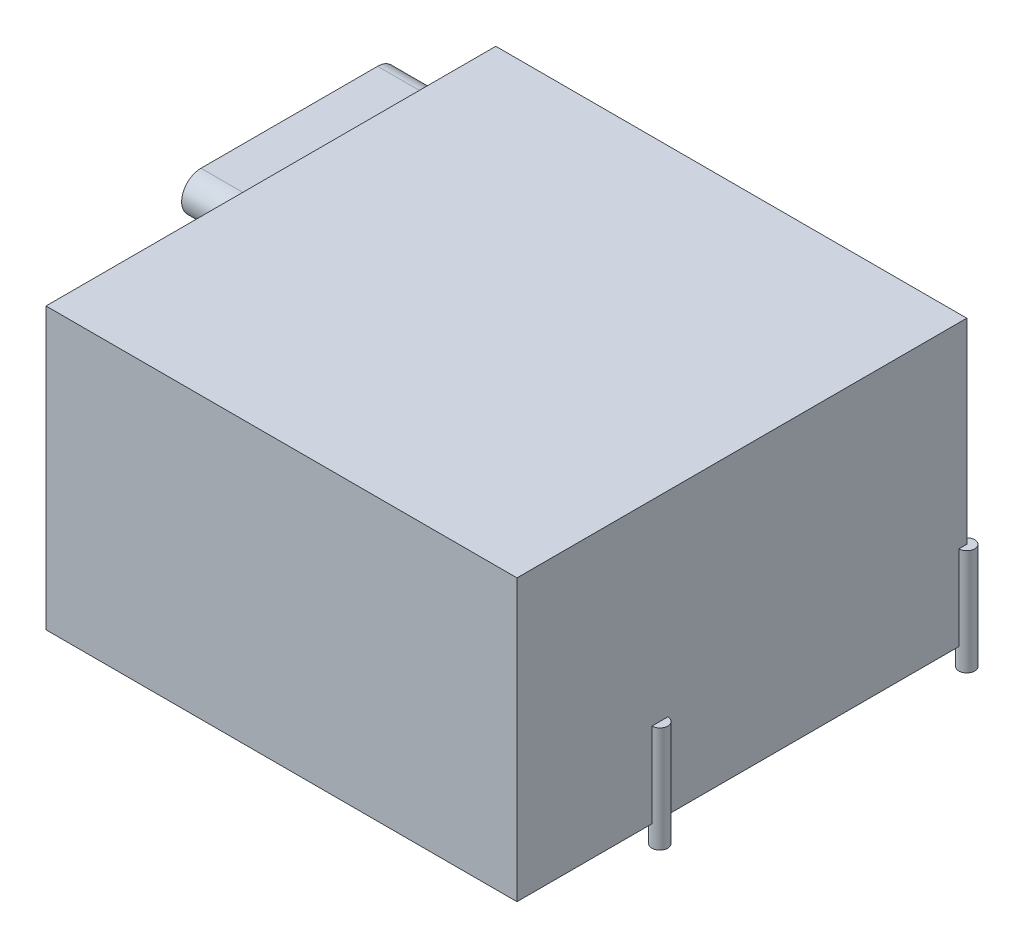
ISO-10303-21;
HEADER;
FILE_DESCRIPTION(('STEP AP214'),'2;1');
FILE_NAME('part.step','',(''),(''),'','','');
FILE_SCHEMA(('AUTOMOTIVE_DESIGN { 1 0 10303 214 1 1 1 1 }'));
ENDSEC;
DATA;
#1=APPLICATION_CONTEXT('core data for automotive mechanical design processes');
#2=APPLICATION_PROTOCOL_DEFINITION('international standard','automotive_design',2000,#1);
#3=PRODUCT_CONTEXT('',#1,'mechanical');
#4=PRODUCT('Part','Part','',(#3));
#5=PRODUCT_RELATED_PRODUCT_CATEGORY('part','',(#4));
#6=PRODUCT_DEFINITION_FORMATION('','',#4);
#7=PRODUCT_DEFINITION_CONTEXT('part definition',#1,'design');
#8=PRODUCT_DEFINITION('design','',#6,#7);
#9=PRODUCT_DEFINITION_SHAPE('','',#8);
#10=(LENGTH_UNIT() NAMED_UNIT(*) SI_UNIT(.MILLI.,.METRE.));
#11=(NAMED_UNIT(*) PLANE_ANGLE_UNIT() SI_UNIT($,.RADIAN.));
#12=(NAMED_UNIT(*) SI_UNIT($,.STERADIAN.) SOLID_ANGLE_UNIT());
#13=UNCERTAINTY_MEASURE_WITH_UNIT(LENGTH_MEASURE(1.E-05),#10,'distance_accuracy_value','');
#14=(GEOMETRIC_REPRESENTATION_CONTEXT(3) GLOBAL_UNCERTAINTY_ASSIGNED_CONTEXT((#13)) GLOBAL_UNIT_ASSIGNED_CONTEXT((#10,
#11,#12)) REPRESENTATION_CONTEXT('',''));
#15=CARTESIAN_POINT('',(0.,0.,0.));
#16=DIRECTION('',(0.,0.,1.));
#17=DIRECTION('',(1.,0.,0.));
#18=AXIS2_PLACEMENT_3D('',#15,#16,#17);
#19=CARTESIAN_POINT('',(-44.5,4.,-29.));
#20=DIRECTION('',(0.,0.,-1.));
#21=DIRECTION('',(-1.,0.,0.));
#22=AXIS2_PLACEMENT_3D('',#19,#20,#21);
#23=PLANE('',#22);
#24=DIRECTION('',(1.,0.,0.));
#25=VECTOR('',#24,1.);
#26=CARTESIAN_POINT('',(-44.5,20.,-29.));
#27=LINE('',#26,#25);
#28=CARTESIAN_POINT('',(43.,20.,-29.));
#29=VERTEX_POINT('',#28);
#30=CARTESIAN_POINT('',(44.5,20.,-29.));
#31=VERTEX_POINT('',#30);
#32=EDGE_CURVE('E11',#29,#31,#27,.T.);
#33=ORIENTED_EDGE('',*,*,#32,.F.);
#34=DIRECTION('',(0.,-1.,0.));
#35=VECTOR('',#34,1.);
#36=CARTESIAN_POINT('',(43.,20.,-29.));
#37=LINE('',#36,#35);
#38=CARTESIAN_POINT('',(43.,4.,-29.));
#39=VERTEX_POINT('',#38);
#40=EDGE_CURVE('E243',#29,#39,#37,.T.);
#41=ORIENTED_EDGE('',*,*,#40,.T.);
#42=DIRECTION('',(-1.,0.,0.));
#43=VECTOR('',#42,1.);
#44=CARTESIAN_POINT('',(-44.5,4.,-29.));
#45=LINE('',#44,#43);
#46=CARTESIAN_POINT('',(-43.,4.,-29.));
#47=VERTEX_POINT('',#46);
#48=EDGE_CURVE('E300',#39,#47,#45,.T.);
#49=ORIENTED_EDGE('',*,*,#48,.T.);
#50=DIRECTION('',(0.,-1.,0.));
#51=VECTOR('',#50,1.);
#52=CARTESIAN_POINT('',(-43.,20.,-29.));
#53=LINE('',#52,#51);
#54=CARTESIAN_POINT('',(-43.,20.,-29.));
#55=VERTEX_POINT('',#54);
#56=EDGE_CURVE('E268',#47,#55,#53,.F.);
#57=ORIENTED_EDGE('',*,*,#56,.T.);
#58=DIRECTION('',(1.,0.,0.));
#59=VECTOR('',#58,1.);
#60=CARTESIAN_POINT('',(-44.5,20.,-29.));
#61=LINE('',#60,#59);
#62=CARTESIAN_POINT('',(-44.5,20.,-29.));
#63=VERTEX_POINT('',#62);
#64=EDGE_CURVE('E330',#63,#55,#61,.T.);
#65=ORIENTED_EDGE('',*,*,#64,.F.);
#66=DIRECTION('',(0.,1.,0.));
#67=VECTOR('',#66,1.);
#68=CARTESIAN_POINT('',(-44.5,4.,-29.));
#69=LINE('',#68,#67);
#70=CARTESIAN_POINT('',(-44.5,57.,-29.));
#71=VERTEX_POINT('',#70);
#72=EDGE_CURVE('E303',#63,#71,#69,.T.);
#73=ORIENTED_EDGE('',*,*,#72,.T.);
#74=DIRECTION('',(-1.,0.,0.));
#75=VECTOR('',#74,1.);
#76=CARTESIAN_POINT('',(-44.5,57.,-29.));
#77=LINE('',#76,#75);
#78=CARTESIAN_POINT('',(44.5,57.,-29.));
#79=VERTEX_POINT('',#78);
#80=EDGE_CURVE('E287',#79,#71,#77,.T.);
#81=ORIENTED_EDGE('',*,*,#80,.F.);
#82=DIRECTION('',(0.,1.,0.));
#83=VECTOR('',#82,1.);
#84=CARTESIAN_POINT('',(44.5,4.,-29.));
#85=LINE('',#84,#83);
#86=EDGE_CURVE('E306',#31,#79,#85,.T.);
#87=ORIENTED_EDGE('',*,*,#86,.F.);
#88=EDGE_LOOP('',(#33,#41,#49,#57,#65,#73,#81,#87));
#89=FACE_BOUND('',#88,.T.);
#90=DIRECTION('',(1.,0.,0.));
#91=VECTOR('',#90,1.);
#92=CARTESIAN_POINT('',(26.8,31.15,-29.));
#93=LINE('',#92,#91);
#94=CARTESIAN_POINT('',(26.8,31.15,-29.));
#95=VERTEX_POINT('',#94);
#96=CARTESIAN_POINT('',(34.8,31.15,-29.));
#97=VERTEX_POINT('',#96);
#98=EDGE_CURVE('E638',#95,#97,#93,.T.);
#99=ORIENTED_EDGE('',*,*,#98,.F.);
#100=DIRECTION('',(0.,1.,0.));
#101=VECTOR('',#100,1.);
#102=CARTESIAN_POINT('',(26.8,23.15,-29.));
#103=LINE('',#102,#101);
#104=CARTESIAN_POINT('',(26.8,23.15,-29.));
#105=VERTEX_POINT('',#104);
#106=EDGE_CURVE('E206',#105,#95,#103,.T.);
#107=ORIENTED_EDGE('',*,*,#106,.F.);
#108=DIRECTION('',(-1.,0.,0.));
#109=VECTOR('',#108,1.);
#110=CARTESIAN_POINT('',(26.8,23.15,-29.));
#111=LINE('',#110,#109);
#112=CARTESIAN_POINT('',(34.8,23.15,-29.));
#113=VERTEX_POINT('',#112);
#114=EDGE_CURVE('E202',#113,#105,#111,.T.);
#115=ORIENTED_EDGE('',*,*,#114,.F.);
#116=DIRECTION('',(0.,-1.,0.));
#117=VECTOR('',#116,1.);
#118=CARTESIAN_POINT('',(34.8,23.15,-29.));
#119=LINE('',#118,#117);
#120=EDGE_CURVE('E635',#97,#113,#119,.T.);
#121=ORIENTED_EDGE('',*,*,#120,.F.);
#122=EDGE_LOOP('',(#99,#107,#115,#121));
#123=FACE_BOUND('',#122,.T.);
#124=ADVANCED_FACE('F45',(#89,#123),#23,.T.);
#125=CARTESIAN_POINT('',(-44.5,4.,-29.));
#126=DIRECTION('',(-1.,0.,0.));
#127=DIRECTION('',(0.,0.,1.));
#128=AXIS2_PLACEMENT_3D('',#125,#126,#127);
#129=PLANE('',#128);
#130=DIRECTION('',(0.,0.,-1.));
#131=VECTOR('',#130,1.);
#132=CARTESIAN_POINT('',(-44.5,20.,-29.));
#133=LINE('',#132,#131);
#134=CARTESIAN_POINT('',(-44.5,20.,-27.5));
#135=VERTEX_POINT('',#134);
#136=EDGE_CURVE('E275',#135,#63,#133,.T.);
#137=ORIENTED_EDGE('',*,*,#136,.F.);
#138=DIRECTION('',(0.,-1.,0.));
#139=VECTOR('',#138,1.);
#140=CARTESIAN_POINT('',(-44.5,20.,-27.5));
#141=LINE('',#140,#139);
#142=CARTESIAN_POINT('',(-44.5,4.,-27.5));
#143=VERTEX_POINT('',#142);
#144=EDGE_CURVE('E272',#135,#143,#141,.T.);
#145=ORIENTED_EDGE('',*,*,#144,.T.);
#146=DIRECTION('',(0.,0.,1.));
#147=VECTOR('',#146,1.);
#148=CARTESIAN_POINT('',(-44.5,4.,-29.));
#149=LINE('',#148,#147);
#150=CARTESIAN_POINT('',(-44.5,4.,27.5));
#151=VERTEX_POINT('',#150);
#152=EDGE_CURVE('E291',#143,#151,#149,.T.);
#153=ORIENTED_EDGE('',*,*,#152,.T.);
#154=DIRECTION('',(0.,-1.,0.));
#155=VECTOR('',#154,1.);
#156=CARTESIAN_POINT('',(-44.5,20.,27.5));
#157=LINE('',#156,#155);
#158=CARTESIAN_POINT('',(-44.5,20.,27.5));
#159=VERTEX_POINT('',#158);
#160=EDGE_CURVE('E313',#159,#151,#157,.T.);
#161=ORIENTED_EDGE('',*,*,#160,.F.);
#162=DIRECTION('',(0.,0.,1.));
#163=VECTOR('',#162,1.);
#164=CARTESIAN_POINT('',(-44.5,20.,29.));
#165=LINE('',#164,#163);
#166=CARTESIAN_POINT('',(-44.5,20.,30.5));
#167=VERTEX_POINT('',#166);
#168=EDGE_CURVE('E319',#159,#167,#165,.T.);
#169=ORIENTED_EDGE('',*,*,#168,.T.);
#170=DIRECTION('',(0.,-1.,0.));
#171=VECTOR('',#170,1.);
#172=CARTESIAN_POINT('',(-44.5,20.,30.5));
#173=LINE('',#172,#171);
#174=CARTESIAN_POINT('',(-44.5,4.,30.5));
#175=VERTEX_POINT('',#174);
#176=EDGE_CURVE('E305',#175,#167,#173,.F.);
#177=ORIENTED_EDGE('',*,*,#176,.F.);
#178=CARTESIAN_POINT('',(-44.5,4.,56.));
#179=VERTEX_POINT('',#178);
#180=EDGE_CURVE('E290',#175,#179,#149,.T.);
#181=ORIENTED_EDGE('',*,*,#180,.T.);
#182=DIRECTION('',(0.,1.,0.));
#183=VECTOR('',#182,1.);
#184=CARTESIAN_POINT('',(-44.5,4.,56.));
#185=LINE('',#184,#183);
#186=CARTESIAN_POINT('',(-44.5,57.,56.));
#187=VERTEX_POINT('',#186);
#188=EDGE_CURVE('E302',#179,#187,#185,.T.);
#189=ORIENTED_EDGE('',*,*,#188,.T.);
#190=DIRECTION('',(0.,0.,1.));
#191=VECTOR('',#190,1.);
#192=CARTESIAN_POINT('',(-44.5,57.,-29.));
#193=LINE('',#192,#191);
#194=EDGE_CURVE('E278',#71,#187,#193,.T.);
#195=ORIENTED_EDGE('',*,*,#194,.F.);
#196=ORIENTED_EDGE('',*,*,#72,.F.);
#197=EDGE_LOOP('',(#137,#145,#153,#161,#169,#177,#181,#189,#195,#196));
#198=FACE_BOUND('',#197,.T.);
#199=DIRECTION('',(0.,0.,1.));
#200=VECTOR('',#199,1.);
#201=CARTESIAN_POINT('',(-44.5,43.5772058939985,-20.661260066863));
#202=LINE('',#201,#200);
#203=CARTESIAN_POINT('',(-44.5,43.5772058939985,-20.661260066863));
#204=VERTEX_POINT('',#203);
#205=CARTESIAN_POINT('',(-44.5,43.5772058939985,12.7112276352466));
#206=VERTEX_POINT('',#205);
#207=EDGE_CURVE('E211',#204,#206,#202,.T.);
#208=ORIENTED_EDGE('',*,*,#207,.F.);
#209=CARTESIAN_POINT('',(-44.5,47.2361932034924,-20.661260066863));
#210=DIRECTION('',(-1.,0.,0.));
#211=DIRECTION('',(0.,0.,1.));
#212=AXIS2_PLACEMENT_3D('',#209,#210,#211);
#213=CIRCLE('',#212,3.65898730949399);
#214=CARTESIAN_POINT('',(-44.5,50.8951805129864,-20.661260066863));
#215=VERTEX_POINT('',#214);
#216=EDGE_CURVE('E208',#215,#204,#213,.T.);
#217=ORIENTED_EDGE('',*,*,#216,.F.);
#218=DIRECTION('',(0.,0.,-1.));
#219=VECTOR('',#218,1.);
#220=CARTESIAN_POINT('',(-44.5,50.8951805129864,-20.661260066863));
#221=LINE('',#220,#219);
#222=CARTESIAN_POINT('',(-44.5,50.8951805129864,12.7112276352466));
#223=VERTEX_POINT('',#222);
#224=EDGE_CURVE('E220',#223,#215,#221,.T.);
#225=ORIENTED_EDGE('',*,*,#224,.F.);
#226=CARTESIAN_POINT('',(-44.5,47.2361932034924,12.7112276352466));
#227=DIRECTION('',(-1.,0.,0.));
#228=DIRECTION('',(0.,0.,1.));
#229=AXIS2_PLACEMENT_3D('',#226,#227,#228);
#230=CIRCLE('',#229,3.65898730949399);
#231=EDGE_CURVE('E228',#206,#223,#230,.T.);
#232=ORIENTED_EDGE('',*,*,#231,.F.);
#233=EDGE_LOOP('',(#208,#217,#225,#232));
#234=FACE_BOUND('',#233,.T.);
#235=ADVANCED_FACE('F370',(#198,#234),#129,.T.);
#236=CARTESIAN_POINT('',(44.5,4.,-29.));
#237=DIRECTION('',(1.,0.,0.));
#238=DIRECTION('',(0.,0.,-1.));
#239=AXIS2_PLACEMENT_3D('',#236,#237,#238);
#240=PLANE('',#239);
#241=DIRECTION('',(0.,0.,-1.));
#242=VECTOR('',#241,1.);
#243=CARTESIAN_POINT('',(44.5,4.,-29.));
#244=LINE('',#243,#242);
#245=CARTESIAN_POINT('',(44.5,4.,27.5));
#246=VERTEX_POINT('',#245);
#247=CARTESIAN_POINT('',(44.5,4.,-27.5));
#248=VERTEX_POINT('',#247);
#249=EDGE_CURVE('E296',#246,#248,#244,.T.);
#250=ORIENTED_EDGE('',*,*,#249,.T.);
#251=DIRECTION('',(0.,-1.,0.));
#252=VECTOR('',#251,1.);
#253=CARTESIAN_POINT('',(44.5,20.,-27.5));
#254=LINE('',#253,#252);
#255=CARTESIAN_POINT('',(44.5,20.,-27.5));
#256=VERTEX_POINT('',#255);
#257=EDGE_CURVE('E248',#248,#256,#254,.F.);
#258=ORIENTED_EDGE('',*,*,#257,.T.);
#259=DIRECTION('',(0.,0.,1.));
#260=VECTOR('',#259,1.);
#261=CARTESIAN_POINT('',(44.5,20.,-29.));
#262=LINE('',#261,#260);
#263=EDGE_CURVE('E250',#31,#256,#262,.T.);
#264=ORIENTED_EDGE('',*,*,#263,.F.);
#265=ORIENTED_EDGE('',*,*,#86,.T.);
#266=DIRECTION('',(0.,0.,-1.));
#267=VECTOR('',#266,1.);
#268=CARTESIAN_POINT('',(44.5,57.,-29.));
#269=LINE('',#268,#267);
#270=CARTESIAN_POINT('',(44.5,57.,56.));
#271=VERTEX_POINT('',#270);
#272=EDGE_CURVE('E284',#271,#79,#269,.T.);
#273=ORIENTED_EDGE('',*,*,#272,.F.);
#274=DIRECTION('',(0.,1.,0.));
#275=VECTOR('',#274,1.);
#276=CARTESIAN_POINT('',(44.5,4.,56.));
#277=LINE('',#276,#275);
#278=CARTESIAN_POINT('',(44.5,4.,56.));
#279=VERTEX_POINT('',#278);
#280=EDGE_CURVE('E308',#279,#271,#277,.T.);
#281=ORIENTED_EDGE('',*,*,#280,.F.);
#282=CARTESIAN_POINT('',(44.5,4.,30.5));
#283=VERTEX_POINT('',#282);
#284=EDGE_CURVE('E297',#279,#283,#244,.T.);
#285=ORIENTED_EDGE('',*,*,#284,.T.);
#286=DIRECTION('',(0.,-1.,0.));
#287=VECTOR('',#286,1.);
#288=CARTESIAN_POINT('',(44.5,20.,30.5));
#289=LINE('',#288,#287);
#290=CARTESIAN_POINT('',(44.5,20.,30.5));
#291=VERTEX_POINT('',#290);
#292=EDGE_CURVE('E262',#283,#291,#289,.F.);
#293=ORIENTED_EDGE('',*,*,#292,.T.);
#294=DIRECTION('',(0.,0.,1.));
#295=VECTOR('',#294,1.);
#296=CARTESIAN_POINT('',(44.5,20.,-29.));
#297=LINE('',#296,#295);
#298=CARTESIAN_POINT('',(44.5,20.,27.5));
#299=VERTEX_POINT('',#298);
#300=EDGE_CURVE('E336',#299,#291,#297,.T.);
#301=ORIENTED_EDGE('',*,*,#300,.F.);
#302=DIRECTION('',(0.,-1.,0.));
#303=VECTOR('',#302,1.);
#304=CARTESIAN_POINT('',(44.5,20.,27.5));
#305=LINE('',#304,#303);
#306=EDGE_CURVE('E257',#299,#246,#305,.T.);
#307=ORIENTED_EDGE('',*,*,#306,.T.);
#308=EDGE_LOOP('',(#250,#258,#264,#265,#273,#281,#285,#293,#301,#307));
#309=FACE_BOUND('',#308,.T.);
#310=ADVANCED_FACE('F350',(#309),#240,.T.);
#311=CARTESIAN_POINT('',(-44.5,20.,29.));
#312=DIRECTION('',(0.,-1.,0.));
#313=DIRECTION('',(0.,0.,-1.));
#314=AXIS2_PLACEMENT_3D('',#311,#312,#313);
#315=CYLINDRICAL_SURFACE('',#314,1.5);
#316=CARTESIAN_POINT('',(-44.5,20.,29.));
#317=DIRECTION('',(0.,1.,0.));
#318=DIRECTION('',(0.,0.,1.));
#319=AXIS2_PLACEMENT_3D('',#316,#317,#318);
#320=CIRCLE('',#319,1.5);
#321=EDGE_CURVE('E317',#159,#167,#320,.T.);
#322=ORIENTED_EDGE('',*,*,#321,.F.);
#323=ORIENTED_EDGE('',*,*,#160,.T.);
#324=CARTESIAN_POINT('',(-44.5,4.,29.));
#325=DIRECTION('',(0.,1.,0.));
#326=DIRECTION('',(0.,0.,1.));
#327=AXIS2_PLACEMENT_3D('',#324,#325,#326);
#328=CIRCLE('',#327,1.5);
#329=EDGE_CURVE('E324',#175,#151,#328,.T.);
#330=ORIENTED_EDGE('',*,*,#329,.F.);
#331=ORIENTED_EDGE('',*,*,#176,.T.);
#332=EDGE_LOOP('',(#322,#323,#330,#331));
#333=FACE_BOUND('',#332,.T.);
#334=CARTESIAN_POINT('',(-44.5,0.,29.));
#335=DIRECTION('',(0.,1.,0.));
#336=DIRECTION('',(0.,0.,1.));
#337=AXIS2_PLACEMENT_3D('',#334,#335,#336);
#338=CIRCLE('',#337,1.5);
#339=CARTESIAN_POINT('',(-44.5,0.,30.5));
#340=VERTEX_POINT('',#339);
#341=EDGE_CURVE('E316',#340,#340,#338,.T.);
#342=ORIENTED_EDGE('',*,*,#341,.T.);
#343=EDGE_LOOP('',(#342));
#344=FACE_BOUND('',#343,.T.);
#345=ADVANCED_FACE('F47',(#333,#344),#315,.T.);
#346=CARTESIAN_POINT('',(-44.5,20.,29.));
#347=DIRECTION('',(0.,1.,0.));
#348=DIRECTION('',(0.,0.,1.));
#349=AXIS2_PLACEMENT_3D('',#346,#347,#348);
#350=PLANE('',#349);
#351=ORIENTED_EDGE('',*,*,#168,.F.);
#352=ORIENTED_EDGE('',*,*,#321,.T.);
#353=EDGE_LOOP('',(#351,#352));
#354=FACE_BOUND('',#353,.T.);
#355=ADVANCED_FACE('F379',(#354),#350,.T.);
#356=CARTESIAN_POINT('',(-44.5,0.,29.));
#357=DIRECTION('',(0.,1.,0.));
#358=DIRECTION('',(0.,0.,1.));
#359=AXIS2_PLACEMENT_3D('',#356,#357,#358);
#360=PLANE('',#359);
#361=ORIENTED_EDGE('',*,*,#341,.F.);
#362=EDGE_LOOP('',(#361));
#363=FACE_BOUND('',#362,.T.);
#364=ADVANCED_FACE('F381',(#363),#360,.F.);
#365=CARTESIAN_POINT('',(-44.5,4.,56.));
#366=DIRECTION('',(0.,0.,1.));
#367=DIRECTION('',(1.,0.,0.));
#368=AXIS2_PLACEMENT_3D('',#365,#366,#367);
#369=PLANE('',#368);
#370=ORIENTED_EDGE('',*,*,#280,.T.);
#371=DIRECTION('',(1.,0.,0.));
#372=VECTOR('',#371,1.);
#373=CARTESIAN_POINT('',(-44.5,57.,56.));
#374=LINE('',#373,#372);
#375=EDGE_CURVE('E281',#187,#271,#374,.T.);
#376=ORIENTED_EDGE('',*,*,#375,.F.);
#377=ORIENTED_EDGE('',*,*,#188,.F.);
#378=DIRECTION('',(1.,0.,0.));
#379=VECTOR('',#378,1.);
#380=CARTESIAN_POINT('',(-44.5,4.,56.));
#381=LINE('',#380,#379);
#382=EDGE_CURVE('E293',#179,#279,#381,.T.);
#383=ORIENTED_EDGE('',*,*,#382,.T.);
#384=EDGE_LOOP('',(#370,#376,#377,#383));
#385=FACE_BOUND('',#384,.T.);
#386=ADVANCED_FACE('F362',(#385),#369,.T.);
#387=CARTESIAN_POINT('',(0.,4.,0.));
#388=DIRECTION('',(0.,1.,0.));
#389=DIRECTION('',(0.,0.,1.));
#390=AXIS2_PLACEMENT_3D('',#387,#388,#389);
#391=PLANE('',#390);
#392=CARTESIAN_POINT('',(44.5,4.,-29.));
#393=DIRECTION('',(0.,1.,0.));
#394=DIRECTION('',(0.,0.,1.));
#395=AXIS2_PLACEMENT_3D('',#392,#393,#394);
#396=CIRCLE('',#395,1.5);
#397=EDGE_CURVE('E53',#248,#39,#396,.F.);
#398=ORIENTED_EDGE('',*,*,#397,.F.);
#399=ORIENTED_EDGE('',*,*,#249,.F.);
#400=CARTESIAN_POINT('',(44.5,4.,29.));
#401=DIRECTION('',(0.,1.,0.));
#402=DIRECTION('',(0.,0.,1.));
#403=AXIS2_PLACEMENT_3D('',#400,#401,#402);
#404=CIRCLE('',#403,1.5);
#405=EDGE_CURVE('E333',#283,#246,#404,.F.);
#406=ORIENTED_EDGE('',*,*,#405,.F.);
#407=ORIENTED_EDGE('',*,*,#284,.F.);
#408=ORIENTED_EDGE('',*,*,#382,.F.);
#409=ORIENTED_EDGE('',*,*,#180,.F.);
#410=ORIENTED_EDGE('',*,*,#329,.T.);
#411=ORIENTED_EDGE('',*,*,#152,.F.);
#412=CARTESIAN_POINT('',(-44.5,4.,-29.));
#413=DIRECTION('',(0.,1.,0.));
#414=DIRECTION('',(0.,0.,1.));
#415=AXIS2_PLACEMENT_3D('',#412,#413,#414);
#416=CIRCLE('',#415,1.5);
#417=EDGE_CURVE('E327',#47,#143,#416,.F.);
#418=ORIENTED_EDGE('',*,*,#417,.F.);
#419=ORIENTED_EDGE('',*,*,#48,.F.);
#420=EDGE_LOOP('',(#398,#399,#406,#407,#408,#409,#410,#411,#418,#419));
#421=FACE_BOUND('',#420,.T.);
#422=ADVANCED_FACE('F347',(#421),#391,.F.);
#423=CARTESIAN_POINT('',(0.,57.,0.));
#424=DIRECTION('',(0.,1.,0.));
#425=DIRECTION('',(0.,0.,1.));
#426=AXIS2_PLACEMENT_3D('',#423,#424,#425);
#427=PLANE('',#426);
#428=ORIENTED_EDGE('',*,*,#194,.T.);
#429=ORIENTED_EDGE('',*,*,#375,.T.);
#430=ORIENTED_EDGE('',*,*,#272,.T.);
#431=ORIENTED_EDGE('',*,*,#80,.T.);
#432=EDGE_LOOP('',(#428,#429,#430,#431));
#433=FACE_BOUND('',#432,.T.);
#434=ADVANCED_FACE('F365',(#433),#427,.T.);
#435=CARTESIAN_POINT('',(-44.5,20.,-29.));
#436=DIRECTION('',(0.,-1.,0.));
#437=DIRECTION('',(0.,0.,-1.));
#438=AXIS2_PLACEMENT_3D('',#435,#436,#437);
#439=CYLINDRICAL_SURFACE('',#438,1.5);
#440=ORIENTED_EDGE('',*,*,#144,.F.);
#441=CARTESIAN_POINT('',(-44.5,20.,-29.));
#442=DIRECTION('',(0.,1.,0.));
#443=DIRECTION('',(0.,0.,1.));
#444=AXIS2_PLACEMENT_3D('',#441,#442,#443);
#445=CIRCLE('',#444,1.5);
#446=EDGE_CURVE('E264',#55,#135,#445,.T.);
#447=ORIENTED_EDGE('',*,*,#446,.F.);
#448=ORIENTED_EDGE('',*,*,#56,.F.);
#449=ORIENTED_EDGE('',*,*,#417,.T.);
#450=EDGE_LOOP('',(#440,#447,#448,#449));
#451=FACE_BOUND('',#450,.T.);
#452=CARTESIAN_POINT('',(-44.5,0.,-29.));
#453=DIRECTION('',(0.,1.,0.));
#454=DIRECTION('',(0.,0.,1.));
#455=AXIS2_PLACEMENT_3D('',#452,#453,#454);
#456=CIRCLE('',#455,1.5);
#457=CARTESIAN_POINT('',(-44.5,0.,-27.5));
#458=VERTEX_POINT('',#457);
#459=EDGE_CURVE('E265',#458,#458,#456,.T.);
#460=ORIENTED_EDGE('',*,*,#459,.T.);
#461=EDGE_LOOP('',(#460));
#462=FACE_BOUND('',#461,.T.);
#463=ADVANCED_FACE('F410',(#451,#462),#439,.T.);
#464=CARTESIAN_POINT('',(-44.5,20.,-29.));
#465=DIRECTION('',(0.,1.,0.));
#466=DIRECTION('',(0.,0.,1.));
#467=AXIS2_PLACEMENT_3D('',#464,#465,#466);
#468=PLANE('',#467);
#469=ORIENTED_EDGE('',*,*,#446,.T.);
#470=ORIENTED_EDGE('',*,*,#136,.T.);
#471=ORIENTED_EDGE('',*,*,#64,.T.);
#472=EDGE_LOOP('',(#469,#470,#471));
#473=FACE_BOUND('',#472,.T.);
#474=ADVANCED_FACE('F414',(#473),#468,.T.);
#475=CARTESIAN_POINT('',(-44.5,0.,-29.));
#476=DIRECTION('',(0.,1.,0.));
#477=DIRECTION('',(0.,0.,1.));
#478=AXIS2_PLACEMENT_3D('',#475,#476,#477);
#479=PLANE('',#478);
#480=ORIENTED_EDGE('',*,*,#459,.F.);
#481=EDGE_LOOP('',(#480));
#482=FACE_BOUND('',#481,.T.);
#483=ADVANCED_FACE('F420',(#482),#479,.F.);
#484=CARTESIAN_POINT('',(44.5,20.,29.));
#485=DIRECTION('',(0.,-1.,0.));
#486=DIRECTION('',(0.,0.,-1.));
#487=AXIS2_PLACEMENT_3D('',#484,#485,#486);
#488=CYLINDRICAL_SURFACE('',#487,1.5);
#489=ORIENTED_EDGE('',*,*,#292,.F.);
#490=ORIENTED_EDGE('',*,*,#405,.T.);
#491=ORIENTED_EDGE('',*,*,#306,.F.);
#492=CARTESIAN_POINT('',(44.5,20.,29.));
#493=DIRECTION('',(0.,1.,0.));
#494=DIRECTION('',(0.,0.,1.));
#495=AXIS2_PLACEMENT_3D('',#492,#493,#494);
#496=CIRCLE('',#495,1.5);
#497=EDGE_CURVE('E253',#291,#299,#496,.T.);
#498=ORIENTED_EDGE('',*,*,#497,.F.);
#499=EDGE_LOOP('',(#489,#490,#491,#498));
#500=FACE_BOUND('',#499,.T.);
#501=CARTESIAN_POINT('',(44.5,0.,29.));
#502=DIRECTION('',(0.,1.,0.));
#503=DIRECTION('',(0.,0.,1.));
#504=AXIS2_PLACEMENT_3D('',#501,#502,#503);
#505=CIRCLE('',#504,1.5);
#506=CARTESIAN_POINT('',(44.5,0.,30.5));
#507=VERTEX_POINT('',#506);
#508=EDGE_CURVE('E254',#507,#507,#505,.T.);
#509=ORIENTED_EDGE('',*,*,#508,.T.);
#510=EDGE_LOOP('',(#509));
#511=FACE_BOUND('',#510,.T.);
#512=ADVANCED_FACE('F355',(#500,#511),#488,.T.);
#513=CARTESIAN_POINT('',(44.5,20.,29.));
#514=DIRECTION('',(0.,1.,0.));
#515=DIRECTION('',(0.,0.,1.));
#516=AXIS2_PLACEMENT_3D('',#513,#514,#515);
#517=PLANE('',#516);
#518=ORIENTED_EDGE('',*,*,#497,.T.);
#519=ORIENTED_EDGE('',*,*,#300,.T.);
#520=EDGE_LOOP('',(#518,#519));
#521=FACE_BOUND('',#520,.T.);
#522=ADVANCED_FACE('F425',(#521),#517,.T.);
#523=CARTESIAN_POINT('',(44.5,0.,29.));
#524=DIRECTION('',(0.,1.,0.));
#525=DIRECTION('',(0.,0.,1.));
#526=AXIS2_PLACEMENT_3D('',#523,#524,#525);
#527=PLANE('',#526);
#528=ORIENTED_EDGE('',*,*,#508,.F.);
#529=EDGE_LOOP('',(#528));
#530=FACE_BOUND('',#529,.T.);
#531=ADVANCED_FACE('F428',(#530),#527,.F.);
#532=CARTESIAN_POINT('',(44.5,20.,-29.));
#533=DIRECTION('',(0.,-1.,0.));
#534=DIRECTION('',(0.,0.,-1.));
#535=AXIS2_PLACEMENT_3D('',#532,#533,#534);
#536=CYLINDRICAL_SURFACE('',#535,1.5);
#537=ORIENTED_EDGE('',*,*,#257,.F.);
#538=ORIENTED_EDGE('',*,*,#397,.T.);
#539=ORIENTED_EDGE('',*,*,#40,.F.);
#540=CARTESIAN_POINT('',(44.5,20.,-29.));
#541=DIRECTION('',(0.,1.,0.));
#542=DIRECTION('',(0.,0.,1.));
#543=AXIS2_PLACEMENT_3D('',#540,#541,#542);
#544=CIRCLE('',#543,1.5);
#545=EDGE_CURVE('E239',#256,#29,#544,.T.);
#546=ORIENTED_EDGE('',*,*,#545,.F.);
#547=EDGE_LOOP('',(#537,#538,#539,#546));
#548=FACE_BOUND('',#547,.T.);
#549=CARTESIAN_POINT('',(44.5,0.,-29.));
#550=DIRECTION('',(0.,1.,0.));
#551=DIRECTION('',(0.,0.,1.));
#552=AXIS2_PLACEMENT_3D('',#549,#550,#551);
#553=CIRCLE('',#552,1.5);
#554=CARTESIAN_POINT('',(44.5,0.,-27.5));
#555=VERTEX_POINT('',#554);
#556=EDGE_CURVE('E240',#555,#555,#553,.T.);
#557=ORIENTED_EDGE('',*,*,#556,.T.);
#558=EDGE_LOOP('',(#557));
#559=FACE_BOUND('',#558,.T.);
#560=ADVANCED_FACE('F342',(#548,#559),#536,.T.);
#561=CARTESIAN_POINT('',(44.5,20.,-29.));
#562=DIRECTION('',(0.,1.,0.));
#563=DIRECTION('',(0.,0.,1.));
#564=AXIS2_PLACEMENT_3D('',#561,#562,#563);
#565=PLANE('',#564);
#566=ORIENTED_EDGE('',*,*,#32,.T.);
#567=ORIENTED_EDGE('',*,*,#263,.T.);
#568=ORIENTED_EDGE('',*,*,#545,.T.);
#569=EDGE_LOOP('',(#566,#567,#568));
#570=FACE_BOUND('',#569,.T.);
#571=ADVANCED_FACE('F435',(#570),#565,.T.);
#572=CARTESIAN_POINT('',(44.5,0.,-29.));
#573=DIRECTION('',(0.,1.,0.));
#574=DIRECTION('',(0.,0.,1.));
#575=AXIS2_PLACEMENT_3D('',#572,#573,#574);
#576=PLANE('',#575);
#577=ORIENTED_EDGE('',*,*,#556,.F.);
#578=EDGE_LOOP('',(#577));
#579=FACE_BOUND('',#578,.T.);
#580=ADVANCED_FACE('F438',(#579),#576,.F.);
#581=CARTESIAN_POINT('',(-58.5,47.2361932034924,-20.661260066863));
#582=DIRECTION('',(1.,0.,0.));
#583=DIRECTION('',(0.,0.,-1.));
#584=AXIS2_PLACEMENT_3D('',#581,#582,#583);
#585=CYLINDRICAL_SURFACE('',#584,3.65898730949399);
#586=ORIENTED_EDGE('',*,*,#216,.T.);
#587=DIRECTION('',(1.,0.,0.));
#588=VECTOR('',#587,1.);
#589=CARTESIAN_POINT('',(-58.5,43.5772058939985,-20.661260066863));
#590=LINE('',#589,#588);
#591=CARTESIAN_POINT('',(-58.5,43.5772058939985,-20.661260066863));
#592=VERTEX_POINT('',#591);
#593=EDGE_CURVE('E237',#592,#204,#590,.T.);
#594=ORIENTED_EDGE('',*,*,#593,.F.);
#595=CARTESIAN_POINT('',(-58.5,47.2361932034924,-20.661260066863));
#596=DIRECTION('',(-1.,0.,0.));
#597=DIRECTION('',(0.,0.,1.));
#598=AXIS2_PLACEMENT_3D('',#595,#596,#597);
#599=CIRCLE('',#598,3.65898730949399);
#600=CARTESIAN_POINT('',(-58.5,50.8951805129864,-20.661260066863));
#601=VERTEX_POINT('',#600);
#602=EDGE_CURVE('E216',#601,#592,#599,.T.);
#603=ORIENTED_EDGE('',*,*,#602,.F.);
#604=DIRECTION('',(1.,0.,0.));
#605=VECTOR('',#604,1.);
#606=CARTESIAN_POINT('',(-58.5,50.8951805129864,-20.661260066863));
#607=LINE('',#606,#605);
#608=EDGE_CURVE('E225',#601,#215,#607,.T.);
#609=ORIENTED_EDGE('',*,*,#608,.T.);
#610=EDGE_LOOP('',(#586,#594,#603,#609));
#611=FACE_BOUND('',#610,.T.);
#612=ADVANCED_FACE('F442',(#611),#585,.T.);
#613=CARTESIAN_POINT('',(-58.5,43.5772058939985,-20.661260066863));
#614=DIRECTION('',(0.,1.,0.));
#615=DIRECTION('',(0.,0.,1.));
#616=AXIS2_PLACEMENT_3D('',#613,#614,#615);
#617=PLANE('',#616);
#618=ORIENTED_EDGE('',*,*,#207,.T.);
#619=DIRECTION('',(1.,0.,0.));
#620=VECTOR('',#619,1.);
#621=CARTESIAN_POINT('',(-58.5,43.5772058939985,12.7112276352466));
#622=LINE('',#621,#620);
#623=CARTESIAN_POINT('',(-58.5,43.5772058939985,12.7112276352466));
#624=VERTEX_POINT('',#623);
#625=EDGE_CURVE('E234',#624,#206,#622,.T.);
#626=ORIENTED_EDGE('',*,*,#625,.F.);
#627=DIRECTION('',(0.,0.,1.));
#628=VECTOR('',#627,1.);
#629=CARTESIAN_POINT('',(-58.5,43.5772058939985,-20.661260066863));
#630=LINE('',#629,#628);
#631=EDGE_CURVE('E219',#592,#624,#630,.T.);
#632=ORIENTED_EDGE('',*,*,#631,.F.);
#633=ORIENTED_EDGE('',*,*,#593,.T.);
#634=EDGE_LOOP('',(#618,#626,#632,#633));
#635=FACE_BOUND('',#634,.T.);
#636=ADVANCED_FACE('F448',(#635),#617,.F.);
#637=CARTESIAN_POINT('',(-58.5,47.2361932034924,12.7112276352466));
#638=DIRECTION('',(1.,0.,0.));
#639=DIRECTION('',(0.,0.,-1.));
#640=AXIS2_PLACEMENT_3D('',#637,#638,#639);
#641=CYLINDRICAL_SURFACE('',#640,3.65898730949399);
#642=ORIENTED_EDGE('',*,*,#231,.T.);
#643=DIRECTION('',(1.,0.,0.));
#644=VECTOR('',#643,1.);
#645=CARTESIAN_POINT('',(-58.5,50.8951805129864,12.7112276352466));
#646=LINE('',#645,#644);
#647=CARTESIAN_POINT('',(-58.5,50.8951805129864,12.7112276352466));
#648=VERTEX_POINT('',#647);
#649=EDGE_CURVE('E68',#648,#223,#646,.T.);
#650=ORIENTED_EDGE('',*,*,#649,.F.);
#651=CARTESIAN_POINT('',(-58.5,47.2361932034924,12.7112276352466));
#652=DIRECTION('',(-1.,0.,0.));
#653=DIRECTION('',(0.,0.,1.));
#654=AXIS2_PLACEMENT_3D('',#651,#652,#653);
#655=CIRCLE('',#654,3.65898730949399);
#656=EDGE_CURVE('E222',#624,#648,#655,.T.);
#657=ORIENTED_EDGE('',*,*,#656,.F.);
#658=ORIENTED_EDGE('',*,*,#625,.T.);
#659=EDGE_LOOP('',(#642,#650,#657,#658));
#660=FACE_BOUND('',#659,.T.);
#661=ADVANCED_FACE('F452',(#660),#641,.T.);
#662=CARTESIAN_POINT('',(-58.5,50.8951805129864,-20.661260066863));
#663=DIRECTION('',(0.,-1.,0.));
#664=DIRECTION('',(0.,0.,-1.));
#665=AXIS2_PLACEMENT_3D('',#662,#663,#664);
#666=PLANE('',#665);
#667=ORIENTED_EDGE('',*,*,#224,.T.);
#668=ORIENTED_EDGE('',*,*,#608,.F.);
#669=DIRECTION('',(0.,0.,-1.));
#670=VECTOR('',#669,1.);
#671=CARTESIAN_POINT('',(-58.5,50.8951805129864,-20.661260066863));
#672=LINE('',#671,#670);
#673=EDGE_CURVE('E224',#648,#601,#672,.T.);
#674=ORIENTED_EDGE('',*,*,#673,.F.);
#675=ORIENTED_EDGE('',*,*,#649,.T.);
#676=EDGE_LOOP('',(#667,#668,#674,#675));
#677=FACE_BOUND('',#676,.T.);
#678=ADVANCED_FACE('F456',(#677),#666,.F.);
#679=CARTESIAN_POINT('',(-58.5,47.2361932034924,-20.661260066863));
#680=DIRECTION('',(-1.,0.,0.));
#681=DIRECTION('',(0.,0.,1.));
#682=AXIS2_PLACEMENT_3D('',#679,#680,#681);
#683=PLANE('',#682);
#684=ORIENTED_EDGE('',*,*,#602,.T.);
#685=ORIENTED_EDGE('',*,*,#631,.T.);
#686=ORIENTED_EDGE('',*,*,#656,.T.);
#687=ORIENTED_EDGE('',*,*,#673,.T.);
#688=EDGE_LOOP('',(#684,#685,#686,#687));
#689=FACE_BOUND('',#688,.T.);
#690=ADVANCED_FACE('F460',(#689),#683,.T.);
#691=CARTESIAN_POINT('',(26.8,23.15,-34.));
#692=DIRECTION('',(1.,0.,0.));
#693=DIRECTION('',(0.,0.,-1.));
#694=AXIS2_PLACEMENT_3D('',#691,#692,#693);
#695=PLANE('',#694);
#696=ORIENTED_EDGE('',*,*,#106,.T.);
#697=DIRECTION('',(0.,0.,1.));
#698=VECTOR('',#697,1.);
#699=CARTESIAN_POINT('',(26.8,31.15,-34.));
#700=LINE('',#699,#698);
#701=CARTESIAN_POINT('',(26.8,31.15,-34.));
#702=VERTEX_POINT('',#701);
#703=EDGE_CURVE('E187',#702,#95,#700,.T.);
#704=ORIENTED_EDGE('',*,*,#703,.F.);
#705=DIRECTION('',(0.,1.,0.));
#706=VECTOR('',#705,1.);
#707=CARTESIAN_POINT('',(26.8,23.15,-34.));
#708=LINE('',#707,#706);
#709=CARTESIAN_POINT('',(26.8,23.15,-34.));
#710=VERTEX_POINT('',#709);
#711=EDGE_CURVE('E194',#710,#702,#708,.T.);
#712=ORIENTED_EDGE('',*,*,#711,.F.);
#713=DIRECTION('',(0.,0.,1.));
#714=VECTOR('',#713,1.);
#715=CARTESIAN_POINT('',(26.8,23.15,-34.));
#716=LINE('',#715,#714);
#717=EDGE_CURVE('E633',#710,#105,#716,.T.);
#718=ORIENTED_EDGE('',*,*,#717,.T.);
#719=EDGE_LOOP('',(#696,#704,#712,#718));
#720=FACE_BOUND('',#719,.T.);
#721=ADVANCED_FACE('F204',(#720),#695,.F.);
#722=CARTESIAN_POINT('',(26.8,31.15,-34.));
#723=DIRECTION('',(0.,-1.,0.));
#724=DIRECTION('',(0.,0.,-1.));
#725=AXIS2_PLACEMENT_3D('',#722,#723,#724);
#726=PLANE('',#725);
#727=ORIENTED_EDGE('',*,*,#98,.T.);
#728=DIRECTION('',(0.,0.,1.));
#729=VECTOR('',#728,1.);
#730=CARTESIAN_POINT('',(34.8,31.15,-34.));
#731=LINE('',#730,#729);
#732=CARTESIAN_POINT('',(34.8,31.15,-34.));
#733=VERTEX_POINT('',#732);
#734=EDGE_CURVE('E190',#733,#97,#731,.T.);
#735=ORIENTED_EDGE('',*,*,#734,.F.);
#736=DIRECTION('',(1.,0.,0.));
#737=VECTOR('',#736,1.);
#738=CARTESIAN_POINT('',(26.8,31.15,-34.));
#739=LINE('',#738,#737);
#740=EDGE_CURVE('E183',#702,#733,#739,.T.);
#741=ORIENTED_EDGE('',*,*,#740,.F.);
#742=ORIENTED_EDGE('',*,*,#703,.T.);
#743=EDGE_LOOP('',(#727,#735,#741,#742));
#744=FACE_BOUND('',#743,.T.);
#745=ADVANCED_FACE('F185',(#744),#726,.F.);
#746=CARTESIAN_POINT('',(34.8,23.15,-34.));
#747=DIRECTION('',(-1.,0.,0.));
#748=DIRECTION('',(0.,0.,1.));
#749=AXIS2_PLACEMENT_3D('',#746,#747,#748);
#750=PLANE('',#749);
#751=ORIENTED_EDGE('',*,*,#120,.T.);
#752=DIRECTION('',(0.,0.,1.));
#753=VECTOR('',#752,1.);
#754=CARTESIAN_POINT('',(34.8,23.15,-34.));
#755=LINE('',#754,#753);
#756=CARTESIAN_POINT('',(34.8,23.15,-34.));
#757=VERTEX_POINT('',#756);
#758=EDGE_CURVE('E60',#757,#113,#755,.T.);
#759=ORIENTED_EDGE('',*,*,#758,.F.);
#760=DIRECTION('',(0.,-1.,0.));
#761=VECTOR('',#760,1.);
#762=CARTESIAN_POINT('',(34.8,23.15,-34.));
#763=LINE('',#762,#761);
#764=EDGE_CURVE('E193',#733,#757,#763,.T.);
#765=ORIENTED_EDGE('',*,*,#764,.F.);
#766=ORIENTED_EDGE('',*,*,#734,.T.);
#767=EDGE_LOOP('',(#751,#759,#765,#766));
#768=FACE_BOUND('',#767,.T.);
#769=ADVANCED_FACE('F466',(#768),#750,.F.);
#770=CARTESIAN_POINT('',(26.8,23.15,-34.));
#771=DIRECTION('',(0.,1.,0.));
#772=DIRECTION('',(0.,0.,1.));
#773=AXIS2_PLACEMENT_3D('',#770,#771,#772);
#774=PLANE('',#773);
#775=ORIENTED_EDGE('',*,*,#114,.T.);
#776=ORIENTED_EDGE('',*,*,#717,.F.);
#777=DIRECTION('',(-1.,0.,0.));
#778=VECTOR('',#777,1.);
#779=CARTESIAN_POINT('',(26.8,23.15,-34.));
#780=LINE('',#779,#778);
#781=EDGE_CURVE('E198',#757,#710,#780,.T.);
#782=ORIENTED_EDGE('',*,*,#781,.F.);
#783=ORIENTED_EDGE('',*,*,#758,.T.);
#784=EDGE_LOOP('',(#775,#776,#782,#783));
#785=FACE_BOUND('',#784,.T.);
#786=ADVANCED_FACE('F469',(#785),#774,.F.);
#787=CARTESIAN_POINT('',(0.,0.,-34.));
#788=DIRECTION('',(0.,0.,-1.));
#789=DIRECTION('',(-1.,0.,0.));
#790=AXIS2_PLACEMENT_3D('',#787,#788,#789);
#791=PLANE('',#790);
#792=ORIENTED_EDGE('',*,*,#711,.T.);
#793=ORIENTED_EDGE('',*,*,#740,.T.);
#794=ORIENTED_EDGE('',*,*,#764,.T.);
#795=ORIENTED_EDGE('',*,*,#781,.T.);
#796=EDGE_LOOP('',(#792,#793,#794,#795));
#797=FACE_BOUND('',#796,.T.);
#798=ADVANCED_FACE('F197',(#797),#791,.T.);
#799=CLOSED_SHELL('',(#124,#235,#310,#345,#355,#364,#386,#422,#434,#463,#474,#483,#512,#522,
#531,#560,#571,#580,#612,#636,#661,#678,#690,#721,#745,#769,#786,#798));
#800=MANIFOLD_SOLID_BREP('B2',#799);
#801=ADVANCED_BREP_SHAPE_REPRESENTATION('',(#18,#800),#14);
#802=SHAPE_DEFINITION_REPRESENTATION(#9,#801);
ENDSEC;
END-ISO-10303-21;
